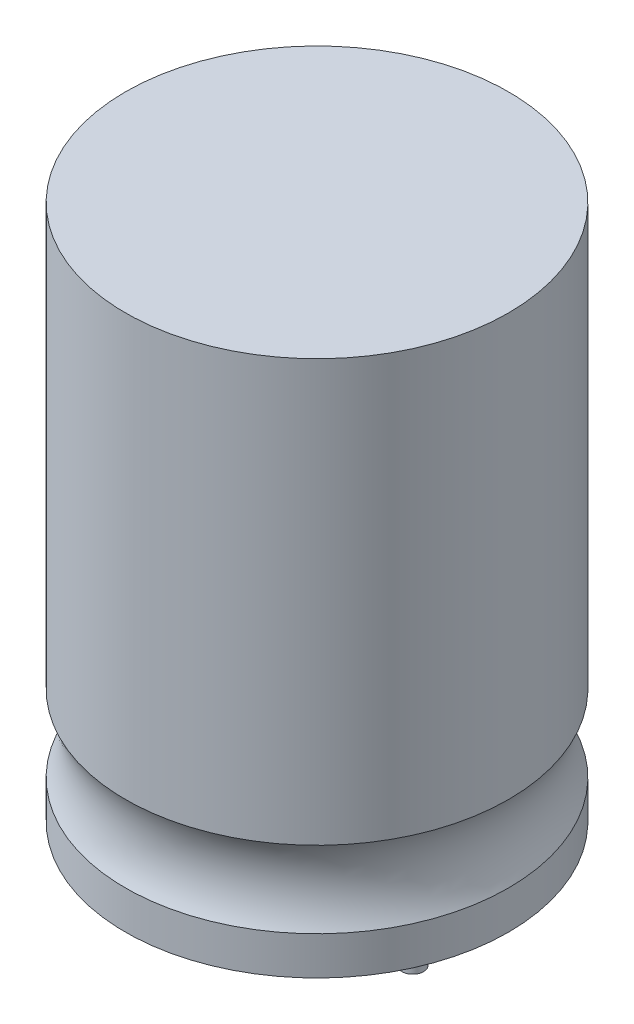
ISO-10303-21;
HEADER;
FILE_DESCRIPTION(('STEP AP214'),'2;1');
FILE_NAME('part.step','',(''),(''),'','','');
FILE_SCHEMA(('AUTOMOTIVE_DESIGN { 1 0 10303 214 1 1 1 1 }'));
ENDSEC;
DATA;
#1=APPLICATION_CONTEXT('core data for automotive mechanical design processes');
#2=APPLICATION_PROTOCOL_DEFINITION('international standard','automotive_design',2000,#1);
#3=PRODUCT_CONTEXT('',#1,'mechanical');
#4=PRODUCT('Part','Part','',(#3));
#5=PRODUCT_RELATED_PRODUCT_CATEGORY('part','',(#4));
#6=PRODUCT_DEFINITION_FORMATION('','',#4);
#7=PRODUCT_DEFINITION_CONTEXT('part definition',#1,'design');
#8=PRODUCT_DEFINITION('design','',#6,#7);
#9=PRODUCT_DEFINITION_SHAPE('','',#8);
#10=(LENGTH_UNIT() NAMED_UNIT(*) SI_UNIT(.MILLI.,.METRE.));
#11=(NAMED_UNIT(*) PLANE_ANGLE_UNIT() SI_UNIT($,.RADIAN.));
#12=(NAMED_UNIT(*) SI_UNIT($,.STERADIAN.) SOLID_ANGLE_UNIT());
#13=UNCERTAINTY_MEASURE_WITH_UNIT(LENGTH_MEASURE(1.E-05),#10,'distance_accuracy_value','');
#14=(GEOMETRIC_REPRESENTATION_CONTEXT(3) GLOBAL_UNCERTAINTY_ASSIGNED_CONTEXT((#13)) GLOBAL_UNIT_ASSIGNED_CONTEXT((#10,
#11,#12)) REPRESENTATION_CONTEXT('',''));
#15=CARTESIAN_POINT('',(0.,0.,0.));
#16=DIRECTION('',(0.,0.,1.));
#17=DIRECTION('',(1.,0.,0.));
#18=AXIS2_PLACEMENT_3D('',#15,#16,#17);
#19=CARTESIAN_POINT('',(0.,14.,0.));
#20=DIRECTION('',(0.,-1.,0.));
#21=DIRECTION('',(1.,0.,0.));
#22=AXIS2_PLACEMENT_3D('',#19,#20,#21);
#23=PLANE('',#22);
#24=CARTESIAN_POINT('',(0.,14.,0.));
#25=DIRECTION('',(0.,1.,0.));
#26=DIRECTION('',(-1.,0.,0.));
#27=AXIS2_PLACEMENT_3D('',#24,#25,#26);
#28=CIRCLE('',#27,5.);
#29=CARTESIAN_POINT('',(-5.,14.,0.));
#30=VERTEX_POINT('',#29);
#31=EDGE_CURVE('E53',#30,#30,#28,.T.);
#32=ORIENTED_EDGE('',*,*,#31,.T.);
#33=EDGE_LOOP('',(#32));
#34=FACE_BOUND('',#33,.T.);
#35=ADVANCED_FACE('F31',(#34),#23,.F.);
#36=CARTESIAN_POINT('',(0.,0.,0.));
#37=DIRECTION('',(0.,1.,0.));
#38=DIRECTION('',(-1.,0.,0.));
#39=AXIS2_PLACEMENT_3D('',#36,#37,#38);
#40=PLANE('',#39);
#41=CARTESIAN_POINT('',(-2.5,0.,0.));
#42=DIRECTION('',(0.,1.,0.));
#43=DIRECTION('',(-1.,0.,0.));
#44=AXIS2_PLACEMENT_3D('',#41,#42,#43);
#45=CIRCLE('',#44,0.282946128311696);
#46=CARTESIAN_POINT('',(-2.7829461283117,0.,0.));
#47=VERTEX_POINT('',#46);
#48=EDGE_CURVE('E10',#47,#47,#45,.F.);
#49=ORIENTED_EDGE('',*,*,#48,.F.);
#50=EDGE_LOOP('',(#49));
#51=FACE_BOUND('',#50,.T.);
#52=CARTESIAN_POINT('',(2.5,0.,0.));
#53=DIRECTION('',(0.,1.,0.));
#54=DIRECTION('',(-1.,0.,0.));
#55=AXIS2_PLACEMENT_3D('',#52,#53,#54);
#56=CIRCLE('',#55,0.282946128311696);
#57=CARTESIAN_POINT('',(2.2170538716883,0.,0.));
#58=VERTEX_POINT('',#57);
#59=EDGE_CURVE('E37',#58,#58,#56,.F.);
#60=ORIENTED_EDGE('',*,*,#59,.F.);
#61=EDGE_LOOP('',(#60));
#62=FACE_BOUND('',#61,.T.);
#63=CARTESIAN_POINT('',(0.,0.,0.));
#64=DIRECTION('',(0.,1.,0.));
#65=DIRECTION('',(-1.,0.,0.));
#66=AXIS2_PLACEMENT_3D('',#63,#64,#65);
#67=CIRCLE('',#66,5.);
#68=CARTESIAN_POINT('',(-5.,0.,0.));
#69=VERTEX_POINT('',#68);
#70=EDGE_CURVE('E41',#69,#69,#67,.T.);
#71=ORIENTED_EDGE('',*,*,#70,.F.);
#72=EDGE_LOOP('',(#71));
#73=FACE_BOUND('',#72,.T.);
#74=ADVANCED_FACE('F78',(#51,#62,#73),#40,.F.);
#75=CARTESIAN_POINT('',(0.,14.,0.));
#76=DIRECTION('',(0.,1.,0.));
#77=DIRECTION('',(-1.,0.,0.));
#78=AXIS2_PLACEMENT_3D('',#75,#76,#77);
#79=CYLINDRICAL_SURFACE('',#78,5.);
#80=CARTESIAN_POINT('',(0.,0.999999999999999,0.));
#81=DIRECTION('',(0.,1.,0.));
#82=DIRECTION('',(-1.,0.,0.));
#83=AXIS2_PLACEMENT_3D('',#80,#81,#82);
#84=CIRCLE('',#83,5.);
#85=CARTESIAN_POINT('',(-5.,0.999999999999999,0.));
#86=VERTEX_POINT('',#85);
#87=EDGE_CURVE('E45',#86,#86,#84,.T.);
#88=ORIENTED_EDGE('',*,*,#87,.F.);
#89=EDGE_LOOP('',(#88));
#90=FACE_BOUND('',#89,.T.);
#91=ORIENTED_EDGE('',*,*,#70,.T.);
#92=EDGE_LOOP('',(#91));
#93=FACE_BOUND('',#92,.T.);
#94=ADVANCED_FACE('F84',(#90,#93),#79,.T.);
#95=CARTESIAN_POINT('',(0.,2.,0.));
#96=DIRECTION('',(0.,1.,0.));
#97=DIRECTION('',(-1.,0.,0.));
#98=AXIS2_PLACEMENT_3D('',#95,#96,#97);
#99=TOROIDAL_SURFACE('',#98,6.73205080756888,2.);
#100=CARTESIAN_POINT('',(0.,3.,0.));
#101=DIRECTION('',(0.,1.,0.));
#102=DIRECTION('',(-1.,0.,0.));
#103=AXIS2_PLACEMENT_3D('',#100,#101,#102);
#104=CIRCLE('',#103,5.);
#105=CARTESIAN_POINT('',(-5.,3.,0.));
#106=VERTEX_POINT('',#105);
#107=EDGE_CURVE('E50',#106,#106,#104,.T.);
#108=ORIENTED_EDGE('',*,*,#107,.F.);
#109=EDGE_LOOP('',(#108));
#110=FACE_BOUND('',#109,.T.);
#111=ORIENTED_EDGE('',*,*,#87,.T.);
#112=EDGE_LOOP('',(#111));
#113=FACE_BOUND('',#112,.T.);
#114=ADVANCED_FACE('F91',(#110,#113),#99,.F.);
#115=CARTESIAN_POINT('',(0.,14.,0.));
#116=DIRECTION('',(0.,1.,0.));
#117=DIRECTION('',(-1.,0.,0.));
#118=AXIS2_PLACEMENT_3D('',#115,#116,#117);
#119=CYLINDRICAL_SURFACE('',#118,5.);
#120=ORIENTED_EDGE('',*,*,#31,.F.);
#121=EDGE_LOOP('',(#120));
#122=FACE_BOUND('',#121,.T.);
#123=ORIENTED_EDGE('',*,*,#107,.T.);
#124=EDGE_LOOP('',(#123));
#125=FACE_BOUND('',#124,.T.);
#126=ADVANCED_FACE('F88',(#122,#125),#119,.T.);
#127=CARTESIAN_POINT('',(2.5,-2.,0.));
#128=DIRECTION('',(0.,1.,0.));
#129=DIRECTION('',(-1.,0.,0.));
#130=AXIS2_PLACEMENT_3D('',#127,#128,#129);
#131=CYLINDRICAL_SURFACE('',#130,0.282946128311696);
#132=CARTESIAN_POINT('',(2.5,-2.,0.));
#133=DIRECTION('',(0.,-1.,0.));
#134=DIRECTION('',(1.,0.,0.));
#135=AXIS2_PLACEMENT_3D('',#132,#133,#134);
#136=CIRCLE('',#135,0.282946128311696);
#137=CARTESIAN_POINT('',(2.7829461283117,-2.,0.));
#138=VERTEX_POINT('',#137);
#139=EDGE_CURVE('E56',#138,#138,#136,.T.);
#140=ORIENTED_EDGE('',*,*,#139,.F.);
#141=EDGE_LOOP('',(#140));
#142=FACE_BOUND('',#141,.T.);
#143=ORIENTED_EDGE('',*,*,#59,.T.);
#144=EDGE_LOOP('',(#143));
#145=FACE_BOUND('',#144,.T.);
#146=ADVANCED_FACE('F74',(#142,#145),#131,.T.);
#147=CARTESIAN_POINT('',(2.5,-2.,0.));
#148=DIRECTION('',(0.,-1.,0.));
#149=DIRECTION('',(1.,0.,0.));
#150=AXIS2_PLACEMENT_3D('',#147,#148,#149);
#151=PLANE('',#150);
#152=ORIENTED_EDGE('',*,*,#139,.T.);
#153=EDGE_LOOP('',(#152));
#154=FACE_BOUND('',#153,.T.);
#155=ADVANCED_FACE('F67',(#154),#151,.T.);
#156=CARTESIAN_POINT('',(-2.5,-2.,0.));
#157=DIRECTION('',(0.,1.,0.));
#158=DIRECTION('',(-1.,0.,0.));
#159=AXIS2_PLACEMENT_3D('',#156,#157,#158);
#160=CYLINDRICAL_SURFACE('',#159,0.282946128311696);
#161=CARTESIAN_POINT('',(-2.5,-2.,0.));
#162=DIRECTION('',(0.,-1.,0.));
#163=DIRECTION('',(1.,0.,0.));
#164=AXIS2_PLACEMENT_3D('',#161,#162,#163);
#165=CIRCLE('',#164,0.282946128311696);
#166=CARTESIAN_POINT('',(-2.2170538716883,-2.,0.));
#167=VERTEX_POINT('',#166);
#168=EDGE_CURVE('E59',#167,#167,#165,.T.);
#169=ORIENTED_EDGE('',*,*,#168,.F.);
#170=EDGE_LOOP('',(#169));
#171=FACE_BOUND('',#170,.T.);
#172=ORIENTED_EDGE('',*,*,#48,.T.);
#173=EDGE_LOOP('',(#172));
#174=FACE_BOUND('',#173,.T.);
#175=ADVANCED_FACE('F65',(#171,#174),#160,.T.);
#176=CARTESIAN_POINT('',(-2.5,-2.,0.));
#177=DIRECTION('',(0.,-1.,0.));
#178=DIRECTION('',(1.,0.,0.));
#179=AXIS2_PLACEMENT_3D('',#176,#177,#178);
#180=PLANE('',#179);
#181=ORIENTED_EDGE('',*,*,#168,.T.);
#182=EDGE_LOOP('',(#181));
#183=FACE_BOUND('',#182,.T.);
#184=ADVANCED_FACE('F63',(#183),#180,.T.);
#185=CLOSED_SHELL('',(#35,#74,#94,#114,#126,#146,#155,#175,#184));
#186=MANIFOLD_SOLID_BREP('B2',#185);
#187=ADVANCED_BREP_SHAPE_REPRESENTATION('',(#18,#186),#14);
#188=SHAPE_DEFINITION_REPRESENTATION(#9,#187);
ENDSEC;
END-ISO-10303-21;
